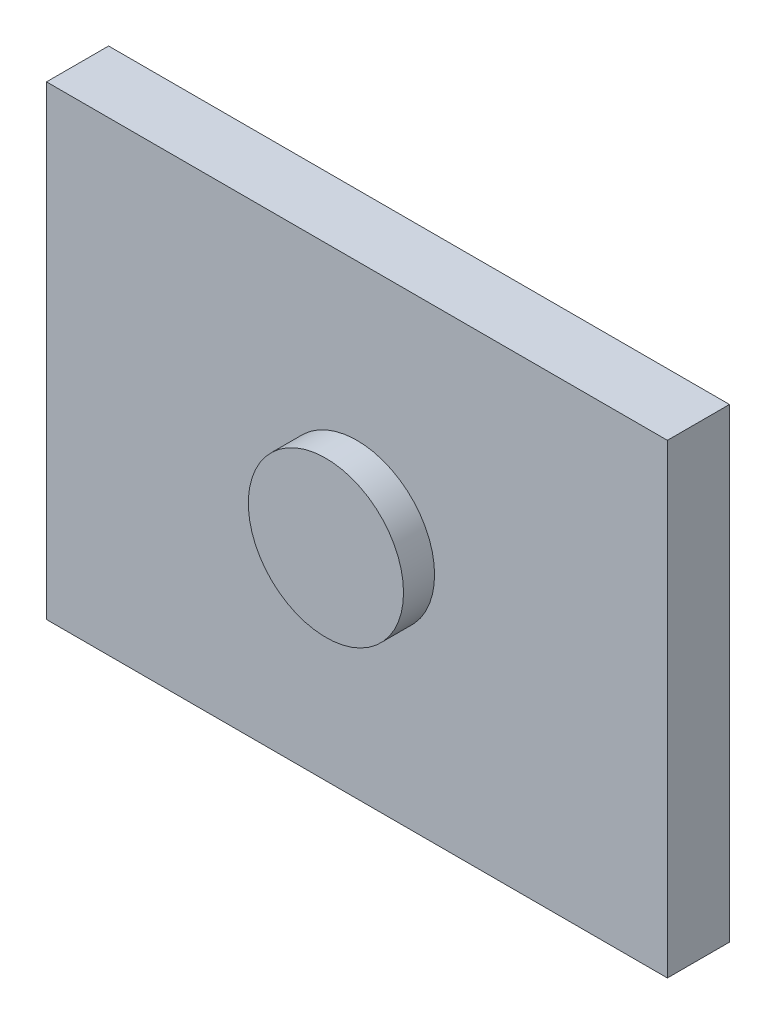
ISO-10303-21;
HEADER;
FILE_DESCRIPTION(('STEP AP214'),'2;1');
FILE_NAME('part.step','',(''),(''),'','','');
FILE_SCHEMA(('AUTOMOTIVE_DESIGN { 1 0 10303 214 1 1 1 1 }'));
ENDSEC;
DATA;
#1=APPLICATION_CONTEXT('core data for automotive mechanical design processes');
#2=APPLICATION_PROTOCOL_DEFINITION('international standard','automotive_design',2000,#1);
#3=PRODUCT_CONTEXT('',#1,'mechanical');
#4=PRODUCT('Part','Part','',(#3));
#5=PRODUCT_RELATED_PRODUCT_CATEGORY('part','',(#4));
#6=PRODUCT_DEFINITION_FORMATION('','',#4);
#7=PRODUCT_DEFINITION_CONTEXT('part definition',#1,'design');
#8=PRODUCT_DEFINITION('design','',#6,#7);
#9=PRODUCT_DEFINITION_SHAPE('','',#8);
#10=(LENGTH_UNIT() NAMED_UNIT(*) SI_UNIT(.MILLI.,.METRE.));
#11=(NAMED_UNIT(*) PLANE_ANGLE_UNIT() SI_UNIT($,.RADIAN.));
#12=(NAMED_UNIT(*) SI_UNIT($,.STERADIAN.) SOLID_ANGLE_UNIT());
#13=UNCERTAINTY_MEASURE_WITH_UNIT(LENGTH_MEASURE(1.E-05),#10,'distance_accuracy_value','');
#14=(GEOMETRIC_REPRESENTATION_CONTEXT(3) GLOBAL_UNCERTAINTY_ASSIGNED_CONTEXT((#13)) GLOBAL_UNIT_ASSIGNED_CONTEXT((#10,
#11,#12)) REPRESENTATION_CONTEXT('',''));
#15=CARTESIAN_POINT('',(0.,0.,0.));
#16=DIRECTION('',(0.,0.,1.));
#17=DIRECTION('',(1.,0.,0.));
#18=AXIS2_PLACEMENT_3D('',#15,#16,#17);
#19=CARTESIAN_POINT('',(100.,-75.,20.));
#20=DIRECTION('',(-1.,0.,0.));
#21=DIRECTION('',(0.,0.,1.));
#22=AXIS2_PLACEMENT_3D('',#19,#20,#21);
#23=PLANE('',#22);
#24=DIRECTION('',(0.,1.,0.));
#25=VECTOR('',#24,1.);
#26=CARTESIAN_POINT('',(100.,-75.,0.));
#27=LINE('',#26,#25);
#28=CARTESIAN_POINT('',(100.,-75.,0.));
#29=VERTEX_POINT('',#28);
#30=CARTESIAN_POINT('',(100.,75.,0.));
#31=VERTEX_POINT('',#30);
#32=EDGE_CURVE('E104',#29,#31,#27,.T.);
#33=ORIENTED_EDGE('',*,*,#32,.T.);
#34=DIRECTION('',(0.,0.,-1.));
#35=VECTOR('',#34,1.);
#36=CARTESIAN_POINT('',(100.,75.,20.));
#37=LINE('',#36,#35);
#38=CARTESIAN_POINT('',(100.,75.,20.));
#39=VERTEX_POINT('',#38);
#40=EDGE_CURVE('E45',#39,#31,#37,.T.);
#41=ORIENTED_EDGE('',*,*,#40,.F.);
#42=DIRECTION('',(0.,1.,0.));
#43=VECTOR('',#42,1.);
#44=CARTESIAN_POINT('',(100.,-75.,20.));
#45=LINE('',#44,#43);
#46=CARTESIAN_POINT('',(100.,-75.,20.));
#47=VERTEX_POINT('',#46);
#48=EDGE_CURVE('E95',#47,#39,#45,.T.);
#49=ORIENTED_EDGE('',*,*,#48,.F.);
#50=DIRECTION('',(0.,0.,-1.));
#51=VECTOR('',#50,1.);
#52=CARTESIAN_POINT('',(100.,-75.,20.));
#53=LINE('',#52,#51);
#54=EDGE_CURVE('E101',#47,#29,#53,.T.);
#55=ORIENTED_EDGE('',*,*,#54,.T.);
#56=EDGE_LOOP('',(#33,#41,#49,#55));
#57=FACE_BOUND('',#56,.T.);
#58=ADVANCED_FACE('F39',(#57),#23,.F.);
#59=CARTESIAN_POINT('',(-100.,75.,20.));
#60=DIRECTION('',(0.,-1.,0.));
#61=DIRECTION('',(0.,0.,-1.));
#62=AXIS2_PLACEMENT_3D('',#59,#60,#61);
#63=PLANE('',#62);
#64=DIRECTION('',(-1.,0.,0.));
#65=VECTOR('',#64,1.);
#66=CARTESIAN_POINT('',(-100.,75.,0.));
#67=LINE('',#66,#65);
#68=CARTESIAN_POINT('',(-100.,75.,0.));
#69=VERTEX_POINT('',#68);
#70=EDGE_CURVE('E100',#31,#69,#67,.T.);
#71=ORIENTED_EDGE('',*,*,#70,.T.);
#72=DIRECTION('',(0.,0.,-1.));
#73=VECTOR('',#72,1.);
#74=CARTESIAN_POINT('',(-100.,75.,20.));
#75=LINE('',#74,#73);
#76=CARTESIAN_POINT('',(-100.,75.,20.));
#77=VERTEX_POINT('',#76);
#78=EDGE_CURVE('E92',#77,#69,#75,.T.);
#79=ORIENTED_EDGE('',*,*,#78,.F.);
#80=DIRECTION('',(-1.,0.,0.));
#81=VECTOR('',#80,1.);
#82=CARTESIAN_POINT('',(-100.,75.,20.));
#83=LINE('',#82,#81);
#84=EDGE_CURVE('E87',#39,#77,#83,.T.);
#85=ORIENTED_EDGE('',*,*,#84,.F.);
#86=ORIENTED_EDGE('',*,*,#40,.T.);
#87=EDGE_LOOP('',(#71,#79,#85,#86));
#88=FACE_BOUND('',#87,.T.);
#89=ADVANCED_FACE('F96',(#88),#63,.F.);
#90=CARTESIAN_POINT('',(-100.,-75.,20.));
#91=DIRECTION('',(1.,0.,0.));
#92=DIRECTION('',(0.,0.,-1.));
#93=AXIS2_PLACEMENT_3D('',#90,#91,#92);
#94=PLANE('',#93);
#95=DIRECTION('',(0.,-1.,0.));
#96=VECTOR('',#95,1.);
#97=CARTESIAN_POINT('',(-100.,-75.,0.));
#98=LINE('',#97,#96);
#99=CARTESIAN_POINT('',(-100.,-75.,0.));
#100=VERTEX_POINT('',#99);
#101=EDGE_CURVE('E71',#69,#100,#98,.T.);
#102=ORIENTED_EDGE('',*,*,#101,.T.);
#103=DIRECTION('',(0.,0.,-1.));
#104=VECTOR('',#103,1.);
#105=CARTESIAN_POINT('',(-100.,-75.,20.));
#106=LINE('',#105,#104);
#107=CARTESIAN_POINT('',(-100.,-75.,20.));
#108=VERTEX_POINT('',#107);
#109=EDGE_CURVE('E98',#108,#100,#106,.T.);
#110=ORIENTED_EDGE('',*,*,#109,.F.);
#111=DIRECTION('',(0.,-1.,0.));
#112=VECTOR('',#111,1.);
#113=CARTESIAN_POINT('',(-100.,-75.,20.));
#114=LINE('',#113,#112);
#115=EDGE_CURVE('E89',#77,#108,#114,.T.);
#116=ORIENTED_EDGE('',*,*,#115,.F.);
#117=ORIENTED_EDGE('',*,*,#78,.T.);
#118=EDGE_LOOP('',(#102,#110,#116,#117));
#119=FACE_BOUND('',#118,.T.);
#120=ADVANCED_FACE('F97',(#119),#94,.F.);
#121=CARTESIAN_POINT('',(-100.,-75.,20.));
#122=DIRECTION('',(0.,1.,0.));
#123=DIRECTION('',(0.,0.,1.));
#124=AXIS2_PLACEMENT_3D('',#121,#122,#123);
#125=PLANE('',#124);
#126=DIRECTION('',(1.,0.,0.));
#127=VECTOR('',#126,1.);
#128=CARTESIAN_POINT('',(-100.,-75.,0.));
#129=LINE('',#128,#127);
#130=EDGE_CURVE('E80',#100,#29,#129,.T.);
#131=ORIENTED_EDGE('',*,*,#130,.T.);
#132=ORIENTED_EDGE('',*,*,#54,.F.);
#133=DIRECTION('',(1.,0.,0.));
#134=VECTOR('',#133,1.);
#135=CARTESIAN_POINT('',(-100.,-75.,20.));
#136=LINE('',#135,#134);
#137=EDGE_CURVE('E57',#108,#47,#136,.T.);
#138=ORIENTED_EDGE('',*,*,#137,.F.);
#139=ORIENTED_EDGE('',*,*,#109,.T.);
#140=EDGE_LOOP('',(#131,#132,#138,#139));
#141=FACE_BOUND('',#140,.T.);
#142=ADVANCED_FACE('F114',(#141),#125,.F.);
#143=CARTESIAN_POINT('',(0.,0.,20.));
#144=DIRECTION('',(0.,0.,-1.));
#145=DIRECTION('',(-1.,0.,0.));
#146=AXIS2_PLACEMENT_3D('',#143,#144,#145);
#147=PLANE('',#146);
#148=CARTESIAN_POINT('',(0.,0.,20.));
#149=DIRECTION('',(0.,0.,1.));
#150=DIRECTION('',(1.,0.,0.));
#151=AXIS2_PLACEMENT_3D('',#148,#149,#150);
#152=CIRCLE('',#151,25.);
#153=CARTESIAN_POINT('',(25.,0.,20.));
#154=VERTEX_POINT('',#153);
#155=EDGE_CURVE('E11',#154,#154,#152,.T.);
#156=ORIENTED_EDGE('',*,*,#155,.F.);
#157=EDGE_LOOP('',(#156));
#158=FACE_BOUND('',#157,.T.);
#159=ORIENTED_EDGE('',*,*,#48,.T.);
#160=ORIENTED_EDGE('',*,*,#84,.T.);
#161=ORIENTED_EDGE('',*,*,#115,.T.);
#162=ORIENTED_EDGE('',*,*,#137,.T.);
#163=EDGE_LOOP('',(#159,#160,#161,#162));
#164=FACE_BOUND('',#163,.T.);
#165=ADVANCED_FACE('F86',(#158,#164),#147,.F.);
#166=CARTESIAN_POINT('',(0.,0.,0.));
#167=DIRECTION('',(0.,0.,-1.));
#168=DIRECTION('',(-1.,0.,0.));
#169=AXIS2_PLACEMENT_3D('',#166,#167,#168);
#170=PLANE('',#169);
#171=ORIENTED_EDGE('',*,*,#32,.F.);
#172=ORIENTED_EDGE('',*,*,#130,.F.);
#173=ORIENTED_EDGE('',*,*,#101,.F.);
#174=ORIENTED_EDGE('',*,*,#70,.F.);
#175=EDGE_LOOP('',(#171,#172,#173,#174));
#176=FACE_BOUND('',#175,.T.);
#177=ADVANCED_FACE('F118',(#176),#170,.T.);
#178=CARTESIAN_POINT('',(0.,0.,30.));
#179=DIRECTION('',(0.,0.,-1.));
#180=DIRECTION('',(-1.,0.,0.));
#181=AXIS2_PLACEMENT_3D('',#178,#179,#180);
#182=CYLINDRICAL_SURFACE('',#181,25.);
#183=CARTESIAN_POINT('',(0.,0.,30.));
#184=DIRECTION('',(0.,0.,1.));
#185=DIRECTION('',(1.,0.,0.));
#186=AXIS2_PLACEMENT_3D('',#183,#184,#185);
#187=CIRCLE('',#186,25.);
#188=CARTESIAN_POINT('',(25.,0.,30.));
#189=VERTEX_POINT('',#188);
#190=EDGE_CURVE('E107',#189,#189,#187,.T.);
#191=ORIENTED_EDGE('',*,*,#190,.F.);
#192=EDGE_LOOP('',(#191));
#193=FACE_BOUND('',#192,.T.);
#194=ORIENTED_EDGE('',*,*,#155,.T.);
#195=EDGE_LOOP('',(#194));
#196=FACE_BOUND('',#195,.T.);
#197=ADVANCED_FACE('F122',(#193,#196),#182,.T.);
#198=CARTESIAN_POINT('',(0.,0.,30.));
#199=DIRECTION('',(0.,0.,1.));
#200=DIRECTION('',(1.,0.,0.));
#201=AXIS2_PLACEMENT_3D('',#198,#199,#200);
#202=PLANE('',#201);
#203=ORIENTED_EDGE('',*,*,#190,.T.);
#204=EDGE_LOOP('',(#203));
#205=FACE_BOUND('',#204,.T.);
#206=ADVANCED_FACE('F125',(#205),#202,.T.);
#207=CLOSED_SHELL('',(#58,#89,#120,#142,#165,#177,#197,#206));
#208=MANIFOLD_SOLID_BREP('B2',#207);
#209=ADVANCED_BREP_SHAPE_REPRESENTATION('',(#18,#208),#14);
#210=SHAPE_DEFINITION_REPRESENTATION(#9,#209);
ENDSEC;
END-ISO-10303-21;
